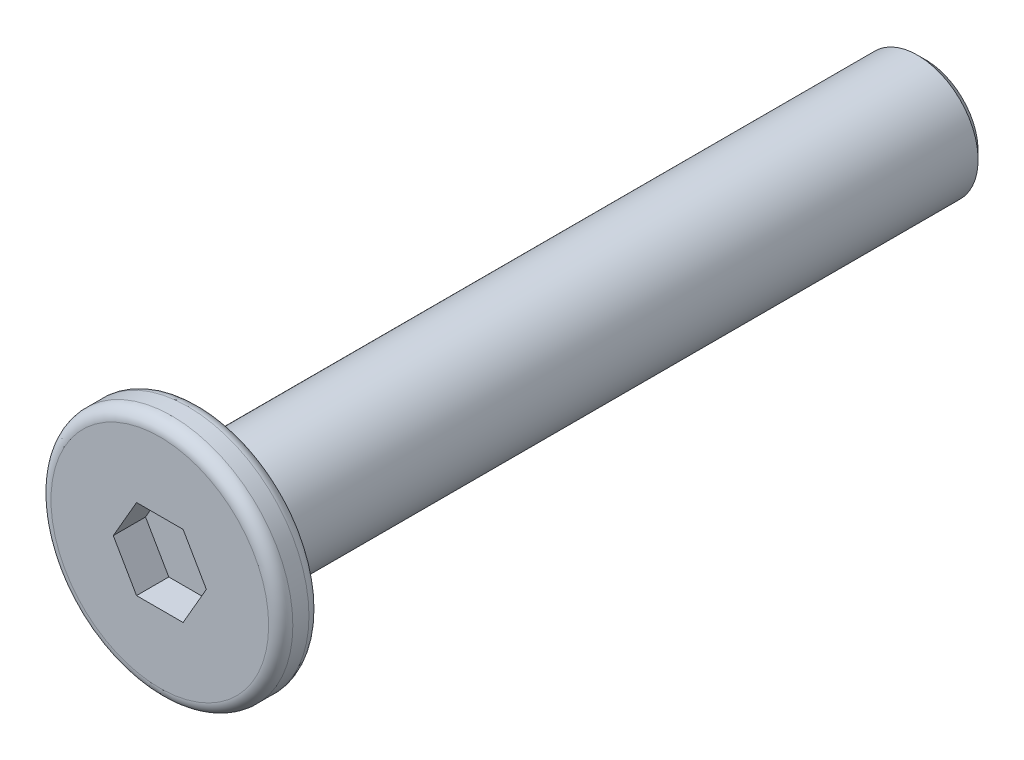
ISO-10303-21;
HEADER;
FILE_DESCRIPTION(('STEP AP214'),'2;1');
FILE_NAME('part.step','',(''),(''),'','','');
FILE_SCHEMA(('AUTOMOTIVE_DESIGN { 1 0 10303 214 1 1 1 1 }'));
ENDSEC;
DATA;
#1=APPLICATION_CONTEXT('core data for automotive mechanical design processes');
#2=APPLICATION_PROTOCOL_DEFINITION('international standard','automotive_design',2000,#1);
#3=PRODUCT_CONTEXT('',#1,'mechanical');
#4=PRODUCT('Part','Part','',(#3));
#5=PRODUCT_RELATED_PRODUCT_CATEGORY('part','',(#4));
#6=PRODUCT_DEFINITION_FORMATION('','',#4);
#7=PRODUCT_DEFINITION_CONTEXT('part definition',#1,'design');
#8=PRODUCT_DEFINITION('design','',#6,#7);
#9=PRODUCT_DEFINITION_SHAPE('','',#8);
#10=(LENGTH_UNIT() NAMED_UNIT(*) SI_UNIT(.MILLI.,.METRE.));
#11=(NAMED_UNIT(*) PLANE_ANGLE_UNIT() SI_UNIT($,.RADIAN.));
#12=(NAMED_UNIT(*) SI_UNIT($,.STERADIAN.) SOLID_ANGLE_UNIT());
#13=UNCERTAINTY_MEASURE_WITH_UNIT(LENGTH_MEASURE(1.E-05),#10,'distance_accuracy_value','');
#14=(GEOMETRIC_REPRESENTATION_CONTEXT(3) GLOBAL_UNCERTAINTY_ASSIGNED_CONTEXT((#13)) GLOBAL_UNIT_ASSIGNED_CONTEXT((#10,
#11,#12)) REPRESENTATION_CONTEXT('',''));
#15=CARTESIAN_POINT('',(0.,0.,0.));
#16=DIRECTION('',(0.,0.,1.));
#17=DIRECTION('',(1.,0.,0.));
#18=AXIS2_PLACEMENT_3D('',#15,#16,#17);
#19=CARTESIAN_POINT('',(0.,0.,0.5));
#20=DIRECTION('',(0.,0.,-1.));
#21=DIRECTION('',(-1.,0.,0.));
#22=AXIS2_PLACEMENT_3D('',#19,#20,#21);
#23=CYLINDRICAL_SURFACE('',#22,3.);
#24=CARTESIAN_POINT('',(0.,0.,-0.2));
#25=DIRECTION('',(0.,0.,1.));
#26=DIRECTION('',(1.,0.,0.));
#27=AXIS2_PLACEMENT_3D('',#24,#25,#26);
#28=CIRCLE('',#27,3.);
#29=CARTESIAN_POINT('',(3.,0.,-0.2));
#30=VERTEX_POINT('',#29);
#31=EDGE_CURVE('E156',#30,#30,#28,.T.);
#32=ORIENTED_EDGE('',*,*,#31,.T.);
#33=EDGE_LOOP('',(#32));
#34=FACE_BOUND('',#33,.T.);
#35=CARTESIAN_POINT('',(0.,0.,0.2));
#36=DIRECTION('',(0.,0.,1.));
#37=DIRECTION('',(1.,0.,0.));
#38=AXIS2_PLACEMENT_3D('',#35,#36,#37);
#39=CIRCLE('',#38,3.);
#40=CARTESIAN_POINT('',(3.,0.,0.2));
#41=VERTEX_POINT('',#40);
#42=EDGE_CURVE('E153',#41,#41,#39,.F.);
#43=ORIENTED_EDGE('',*,*,#42,.T.);
#44=EDGE_LOOP('',(#43));
#45=FACE_BOUND('',#44,.T.);
#46=ADVANCED_FACE('F37',(#34,#45),#23,.T.);
#47=CARTESIAN_POINT('',(0.,0.,0.5));
#48=DIRECTION('',(0.,0.,1.));
#49=DIRECTION('',(1.,0.,0.));
#50=AXIS2_PLACEMENT_3D('',#47,#48,#49);
#51=PLANE('',#50);
#52=CARTESIAN_POINT('',(0.,0.,0.5));
#53=DIRECTION('',(0.,0.,1.));
#54=DIRECTION('',(1.,0.,0.));
#55=AXIS2_PLACEMENT_3D('',#52,#53,#54);
#56=CIRCLE('',#55,2.7);
#57=CARTESIAN_POINT('',(2.7,0.,0.5));
#58=VERTEX_POINT('',#57);
#59=EDGE_CURVE('E11',#58,#58,#56,.T.);
#60=ORIENTED_EDGE('',*,*,#59,.T.);
#61=EDGE_LOOP('',(#60));
#62=FACE_BOUND('',#61,.T.);
#63=DIRECTION('',(0.5,0.866025403784439,0.));
#64=VECTOR('',#63,1.);
#65=CARTESIAN_POINT('',(0.577350269189626,-1.,0.5));
#66=LINE('',#65,#64);
#67=CARTESIAN_POINT('',(0.577350269189626,-1.,0.5));
#68=VERTEX_POINT('',#67);
#69=CARTESIAN_POINT('',(1.15470053837925,0.,0.5));
#70=VERTEX_POINT('',#69);
#71=EDGE_CURVE('E52',#68,#70,#66,.T.);
#72=ORIENTED_EDGE('',*,*,#71,.F.);
#73=DIRECTION('',(1.,0.,0.));
#74=VECTOR('',#73,1.);
#75=CARTESIAN_POINT('',(-0.577350269189625,-1.,0.5));
#76=LINE('',#75,#74);
#77=CARTESIAN_POINT('',(-0.577350269189625,-1.,0.5));
#78=VERTEX_POINT('',#77);
#79=EDGE_CURVE('E135',#78,#68,#76,.T.);
#80=ORIENTED_EDGE('',*,*,#79,.F.);
#81=DIRECTION('',(0.5,-0.866025403784438,0.));
#82=VECTOR('',#81,1.);
#83=CARTESIAN_POINT('',(-1.15470053837925,0.,0.5));
#84=LINE('',#83,#82);
#85=CARTESIAN_POINT('',(-1.15470053837925,0.,0.5));
#86=VERTEX_POINT('',#85);
#87=EDGE_CURVE('E133',#86,#78,#84,.T.);
#88=ORIENTED_EDGE('',*,*,#87,.F.);
#89=DIRECTION('',(-0.5,-0.866025403784438,0.));
#90=VECTOR('',#89,1.);
#91=CARTESIAN_POINT('',(-0.577350269189626,1.,0.5));
#92=LINE('',#91,#90);
#93=CARTESIAN_POINT('',(-0.577350269189626,1.,0.5));
#94=VERTEX_POINT('',#93);
#95=EDGE_CURVE('E100',#94,#86,#92,.T.);
#96=ORIENTED_EDGE('',*,*,#95,.F.);
#97=DIRECTION('',(-1.,0.,0.));
#98=VECTOR('',#97,1.);
#99=CARTESIAN_POINT('',(0.577350269189625,1.,0.5));
#100=LINE('',#99,#98);
#101=CARTESIAN_POINT('',(0.577350269189625,1.,0.5));
#102=VERTEX_POINT('',#101);
#103=EDGE_CURVE('E129',#102,#94,#100,.T.);
#104=ORIENTED_EDGE('',*,*,#103,.F.);
#105=DIRECTION('',(-0.5,0.866025403784438,0.));
#106=VECTOR('',#105,1.);
#107=CARTESIAN_POINT('',(1.15470053837925,0.,0.5));
#108=LINE('',#107,#106);
#109=EDGE_CURVE('E126',#70,#102,#108,.T.);
#110=ORIENTED_EDGE('',*,*,#109,.F.);
#111=EDGE_LOOP('',(#72,#80,#88,#96,#104,#110));
#112=FACE_BOUND('',#111,.T.);
#113=ADVANCED_FACE('F171',(#62,#112),#51,.T.);
#114=CARTESIAN_POINT('',(0.,0.,-0.5));
#115=DIRECTION('',(0.,0.,1.));
#116=DIRECTION('',(1.,0.,0.));
#117=AXIS2_PLACEMENT_3D('',#114,#115,#116);
#118=PLANE('',#117);
#119=CARTESIAN_POINT('',(0.,0.,-0.5));
#120=DIRECTION('',(0.,0.,1.));
#121=DIRECTION('',(1.,0.,0.));
#122=AXIS2_PLACEMENT_3D('',#119,#120,#121);
#123=CIRCLE('',#122,2.7);
#124=CARTESIAN_POINT('',(2.7,0.,-0.5));
#125=VERTEX_POINT('',#124);
#126=EDGE_CURVE('E45',#125,#125,#123,.F.);
#127=ORIENTED_EDGE('',*,*,#126,.T.);
#128=EDGE_LOOP('',(#127));
#129=FACE_BOUND('',#128,.T.);
#130=CARTESIAN_POINT('',(0.,0.,-0.5));
#131=DIRECTION('',(0.,0.,-1.));
#132=DIRECTION('',(-1.,0.,0.));
#133=AXIS2_PLACEMENT_3D('',#130,#131,#132);
#134=CIRCLE('',#133,1.5);
#135=CARTESIAN_POINT('',(-1.5,0.,-0.5));
#136=VERTEX_POINT('',#135);
#137=EDGE_CURVE('E139',#136,#136,#134,.T.);
#138=ORIENTED_EDGE('',*,*,#137,.F.);
#139=EDGE_LOOP('',(#138));
#140=FACE_BOUND('',#139,.T.);
#141=ADVANCED_FACE('F161',(#129,#140),#118,.F.);
#142=CARTESIAN_POINT('',(0.,0.,-18.5));
#143=DIRECTION('',(0.,0.,1.));
#144=DIRECTION('',(1.,0.,0.));
#145=AXIS2_PLACEMENT_3D('',#142,#143,#144);
#146=CYLINDRICAL_SURFACE('',#145,1.5);
#147=CARTESIAN_POINT('',(0.,0.,-18.3));
#148=DIRECTION('',(0.,0.,-1.));
#149=DIRECTION('',(-1.,0.,0.));
#150=AXIS2_PLACEMENT_3D('',#147,#148,#149);
#151=CIRCLE('',#150,1.5);
#152=CARTESIAN_POINT('',(-1.5,0.,-18.3));
#153=VERTEX_POINT('',#152);
#154=EDGE_CURVE('E150',#153,#153,#151,.F.);
#155=ORIENTED_EDGE('',*,*,#154,.T.);
#156=EDGE_LOOP('',(#155));
#157=FACE_BOUND('',#156,.T.);
#158=ORIENTED_EDGE('',*,*,#137,.T.);
#159=EDGE_LOOP('',(#158));
#160=FACE_BOUND('',#159,.T.);
#161=ADVANCED_FACE('F206',(#157,#160),#146,.T.);
#162=CARTESIAN_POINT('',(0.,0.,-18.5));
#163=DIRECTION('',(0.,0.,-1.));
#164=DIRECTION('',(-1.,0.,0.));
#165=AXIS2_PLACEMENT_3D('',#162,#163,#164);
#166=PLANE('',#165);
#167=CARTESIAN_POINT('',(0.,0.,-18.5));
#168=DIRECTION('',(0.,0.,-1.));
#169=DIRECTION('',(-1.,0.,0.));
#170=AXIS2_PLACEMENT_3D('',#167,#168,#169);
#171=CIRCLE('',#170,1.3);
#172=CARTESIAN_POINT('',(-1.3,0.,-18.5));
#173=VERTEX_POINT('',#172);
#174=EDGE_CURVE('E147',#173,#173,#171,.T.);
#175=ORIENTED_EDGE('',*,*,#174,.T.);
#176=EDGE_LOOP('',(#175));
#177=FACE_BOUND('',#176,.T.);
#178=ADVANCED_FACE('F198',(#177),#166,.T.);
#179=CARTESIAN_POINT('',(0.,0.,-18.5));
#180=DIRECTION('',(0.,0.,1.));
#181=DIRECTION('',(1.,0.,0.));
#182=AXIS2_PLACEMENT_3D('',#179,#180,#181);
#183=CONICAL_SURFACE('',#182,1.3,0.785398163397459);
#184=ORIENTED_EDGE('',*,*,#154,.F.);
#185=EDGE_LOOP('',(#184));
#186=FACE_BOUND('',#185,.T.);
#187=ORIENTED_EDGE('',*,*,#174,.F.);
#188=EDGE_LOOP('',(#187));
#189=FACE_BOUND('',#188,.T.);
#190=ADVANCED_FACE('F191',(#186,#189),#183,.T.);
#191=CARTESIAN_POINT('',(0.577350269189626,-1.,-0.3));
#192=DIRECTION('',(0.866025403784439,-0.5,0.));
#193=DIRECTION('',(0.5,0.866025403784439,0.));
#194=AXIS2_PLACEMENT_3D('',#191,#192,#193);
#195=PLANE('',#194);
#196=ORIENTED_EDGE('',*,*,#71,.T.);
#197=DIRECTION('',(0.,0.,1.));
#198=VECTOR('',#197,1.);
#199=CARTESIAN_POINT('',(1.15470053837925,0.,-0.3));
#200=LINE('',#199,#198);
#201=CARTESIAN_POINT('',(1.15470053837925,0.,-0.3));
#202=VERTEX_POINT('',#201);
#203=EDGE_CURVE('E82',#202,#70,#200,.T.);
#204=ORIENTED_EDGE('',*,*,#203,.F.);
#205=DIRECTION('',(0.5,0.866025403784439,0.));
#206=VECTOR('',#205,1.);
#207=CARTESIAN_POINT('',(0.577350269189626,-1.,-0.3));
#208=LINE('',#207,#206);
#209=CARTESIAN_POINT('',(0.577350269189626,-1.,-0.3));
#210=VERTEX_POINT('',#209);
#211=EDGE_CURVE('E137',#210,#202,#208,.T.);
#212=ORIENTED_EDGE('',*,*,#211,.F.);
#213=DIRECTION('',(0.,0.,1.));
#214=VECTOR('',#213,1.);
#215=CARTESIAN_POINT('',(0.577350269189626,-1.,-0.3));
#216=LINE('',#215,#214);
#217=EDGE_CURVE('E60',#210,#68,#216,.T.);
#218=ORIENTED_EDGE('',*,*,#217,.T.);
#219=EDGE_LOOP('',(#196,#204,#212,#218));
#220=FACE_BOUND('',#219,.T.);
#221=ADVANCED_FACE('F188',(#220),#195,.F.);
#222=CARTESIAN_POINT('',(-0.577350269189625,-1.,-0.3));
#223=DIRECTION('',(0.,-1.,0.));
#224=DIRECTION('',(1.,0.,0.));
#225=AXIS2_PLACEMENT_3D('',#222,#223,#224);
#226=PLANE('',#225);
#227=ORIENTED_EDGE('',*,*,#79,.T.);
#228=ORIENTED_EDGE('',*,*,#217,.F.);
#229=DIRECTION('',(1.,0.,0.));
#230=VECTOR('',#229,1.);
#231=CARTESIAN_POINT('',(-0.577350269189625,-1.,-0.3));
#232=LINE('',#231,#230);
#233=CARTESIAN_POINT('',(-0.577350269189625,-1.,-0.3));
#234=VERTEX_POINT('',#233);
#235=EDGE_CURVE('E112',#234,#210,#232,.T.);
#236=ORIENTED_EDGE('',*,*,#235,.F.);
#237=DIRECTION('',(0.,0.,1.));
#238=VECTOR('',#237,1.);
#239=CARTESIAN_POINT('',(-0.577350269189625,-1.,-0.3));
#240=LINE('',#239,#238);
#241=EDGE_CURVE('E104',#234,#78,#240,.T.);
#242=ORIENTED_EDGE('',*,*,#241,.T.);
#243=EDGE_LOOP('',(#227,#228,#236,#242));
#244=FACE_BOUND('',#243,.T.);
#245=ADVANCED_FACE('F190',(#244),#226,.F.);
#246=CARTESIAN_POINT('',(-1.15470053837925,0.,-0.3));
#247=DIRECTION('',(-0.866025403784438,-0.5,0.));
#248=DIRECTION('',(0.5,-0.866025403784438,0.));
#249=AXIS2_PLACEMENT_3D('',#246,#247,#248);
#250=PLANE('',#249);
#251=ORIENTED_EDGE('',*,*,#87,.T.);
#252=ORIENTED_EDGE('',*,*,#241,.F.);
#253=DIRECTION('',(0.5,-0.866025403784438,0.));
#254=VECTOR('',#253,1.);
#255=CARTESIAN_POINT('',(-1.15470053837925,0.,-0.3));
#256=LINE('',#255,#254);
#257=CARTESIAN_POINT('',(-1.15470053837925,0.,-0.3));
#258=VERTEX_POINT('',#257);
#259=EDGE_CURVE('E108',#258,#234,#256,.T.);
#260=ORIENTED_EDGE('',*,*,#259,.F.);
#261=DIRECTION('',(0.,0.,1.));
#262=VECTOR('',#261,1.);
#263=CARTESIAN_POINT('',(-1.15470053837925,0.,-0.3));
#264=LINE('',#263,#262);
#265=EDGE_CURVE('E93',#258,#86,#264,.T.);
#266=ORIENTED_EDGE('',*,*,#265,.T.);
#267=EDGE_LOOP('',(#251,#252,#260,#266));
#268=FACE_BOUND('',#267,.T.);
#269=ADVANCED_FACE('F109',(#268),#250,.F.);
#270=CARTESIAN_POINT('',(-0.577350269189626,1.,-0.3));
#271=DIRECTION('',(-0.866025403784438,0.5,0.));
#272=DIRECTION('',(-0.5,-0.866025403784439,0.));
#273=AXIS2_PLACEMENT_3D('',#270,#271,#272);
#274=PLANE('',#273);
#275=ORIENTED_EDGE('',*,*,#95,.T.);
#276=ORIENTED_EDGE('',*,*,#265,.F.);
#277=DIRECTION('',(-0.5,-0.866025403784438,0.));
#278=VECTOR('',#277,1.);
#279=CARTESIAN_POINT('',(-0.577350269189626,1.,-0.3));
#280=LINE('',#279,#278);
#281=CARTESIAN_POINT('',(-0.577350269189626,1.,-0.3));
#282=VERTEX_POINT('',#281);
#283=EDGE_CURVE('E97',#282,#258,#280,.T.);
#284=ORIENTED_EDGE('',*,*,#283,.F.);
#285=DIRECTION('',(0.,0.,1.));
#286=VECTOR('',#285,1.);
#287=CARTESIAN_POINT('',(-0.577350269189626,1.,-0.3));
#288=LINE('',#287,#286);
#289=EDGE_CURVE('E105',#282,#94,#288,.T.);
#290=ORIENTED_EDGE('',*,*,#289,.T.);
#291=EDGE_LOOP('',(#275,#276,#284,#290));
#292=FACE_BOUND('',#291,.T.);
#293=ADVANCED_FACE('F95',(#292),#274,.F.);
#294=CARTESIAN_POINT('',(0.577350269189625,1.,-0.3));
#295=DIRECTION('',(0.,1.,0.));
#296=DIRECTION('',(0.,0.,1.));
#297=AXIS2_PLACEMENT_3D('',#294,#295,#296);
#298=PLANE('',#297);
#299=ORIENTED_EDGE('',*,*,#103,.T.);
#300=ORIENTED_EDGE('',*,*,#289,.F.);
#301=DIRECTION('',(-1.,0.,0.));
#302=VECTOR('',#301,1.);
#303=CARTESIAN_POINT('',(0.577350269189625,1.,-0.3));
#304=LINE('',#303,#302);
#305=CARTESIAN_POINT('',(0.577350269189625,1.,-0.3));
#306=VERTEX_POINT('',#305);
#307=EDGE_CURVE('E118',#306,#282,#304,.T.);
#308=ORIENTED_EDGE('',*,*,#307,.F.);
#309=DIRECTION('',(0.,0.,1.));
#310=VECTOR('',#309,1.);
#311=CARTESIAN_POINT('',(0.577350269189625,1.,-0.3));
#312=LINE('',#311,#310);
#313=EDGE_CURVE('E142',#306,#102,#312,.T.);
#314=ORIENTED_EDGE('',*,*,#313,.T.);
#315=EDGE_LOOP('',(#299,#300,#308,#314));
#316=FACE_BOUND('',#315,.T.);
#317=ADVANCED_FACE('F259',(#316),#298,.F.);
#318=CARTESIAN_POINT('',(1.15470053837925,0.,-0.3));
#319=DIRECTION('',(0.866025403784438,0.5,0.));
#320=DIRECTION('',(-0.5,0.866025403784439,0.));
#321=AXIS2_PLACEMENT_3D('',#318,#319,#320);
#322=PLANE('',#321);
#323=ORIENTED_EDGE('',*,*,#109,.T.);
#324=ORIENTED_EDGE('',*,*,#313,.F.);
#325=DIRECTION('',(-0.5,0.866025403784438,0.));
#326=VECTOR('',#325,1.);
#327=CARTESIAN_POINT('',(1.15470053837925,0.,-0.3));
#328=LINE('',#327,#326);
#329=EDGE_CURVE('E120',#202,#306,#328,.T.);
#330=ORIENTED_EDGE('',*,*,#329,.F.);
#331=ORIENTED_EDGE('',*,*,#203,.T.);
#332=EDGE_LOOP('',(#323,#324,#330,#331));
#333=FACE_BOUND('',#332,.T.);
#334=ADVANCED_FACE('F186',(#333),#322,.F.);
#335=CARTESIAN_POINT('',(0.,0.,-0.3));
#336=DIRECTION('',(0.,0.,1.));
#337=DIRECTION('',(1.,0.,0.));
#338=AXIS2_PLACEMENT_3D('',#335,#336,#337);
#339=PLANE('',#338);
#340=ORIENTED_EDGE('',*,*,#211,.T.);
#341=ORIENTED_EDGE('',*,*,#329,.T.);
#342=ORIENTED_EDGE('',*,*,#307,.T.);
#343=ORIENTED_EDGE('',*,*,#283,.T.);
#344=ORIENTED_EDGE('',*,*,#259,.T.);
#345=ORIENTED_EDGE('',*,*,#235,.T.);
#346=EDGE_LOOP('',(#340,#341,#342,#343,#344,#345));
#347=FACE_BOUND('',#346,.T.);
#348=ADVANCED_FACE('F115',(#347),#339,.T.);
#349=CARTESIAN_POINT('',(0.,0.,-0.2));
#350=DIRECTION('',(0.,0.,1.));
#351=DIRECTION('',(1.,0.,0.));
#352=AXIS2_PLACEMENT_3D('',#349,#350,#351);
#353=TOROIDAL_SURFACE('',#352,2.7,0.3);
#354=ORIENTED_EDGE('',*,*,#126,.F.);
#355=EDGE_LOOP('',(#354));
#356=FACE_BOUND('',#355,.T.);
#357=ORIENTED_EDGE('',*,*,#31,.F.);
#358=EDGE_LOOP('',(#357));
#359=FACE_BOUND('',#358,.T.);
#360=ADVANCED_FACE('F164',(#356,#359),#353,.T.);
#361=CARTESIAN_POINT('',(0.,0.,0.2));
#362=DIRECTION('',(0.,0.,1.));
#363=DIRECTION('',(1.,0.,0.));
#364=AXIS2_PLACEMENT_3D('',#361,#362,#363);
#365=TOROIDAL_SURFACE('',#364,2.7,0.3);
#366=ORIENTED_EDGE('',*,*,#42,.F.);
#367=EDGE_LOOP('',(#366));
#368=FACE_BOUND('',#367,.T.);
#369=ORIENTED_EDGE('',*,*,#59,.F.);
#370=EDGE_LOOP('',(#369));
#371=FACE_BOUND('',#370,.T.);
#372=ADVANCED_FACE('F39',(#368,#371),#365,.T.);
#373=CLOSED_SHELL('',(#46,#113,#141,#161,#178,#190,#221,#245,#269,#293,#317,#334,#348,#360,#372));
#374=MANIFOLD_SOLID_BREP('B2',#373);
#375=ADVANCED_BREP_SHAPE_REPRESENTATION('',(#18,#374),#14);
#376=SHAPE_DEFINITION_REPRESENTATION(#9,#375);
ENDSEC;
END-ISO-10303-21;
